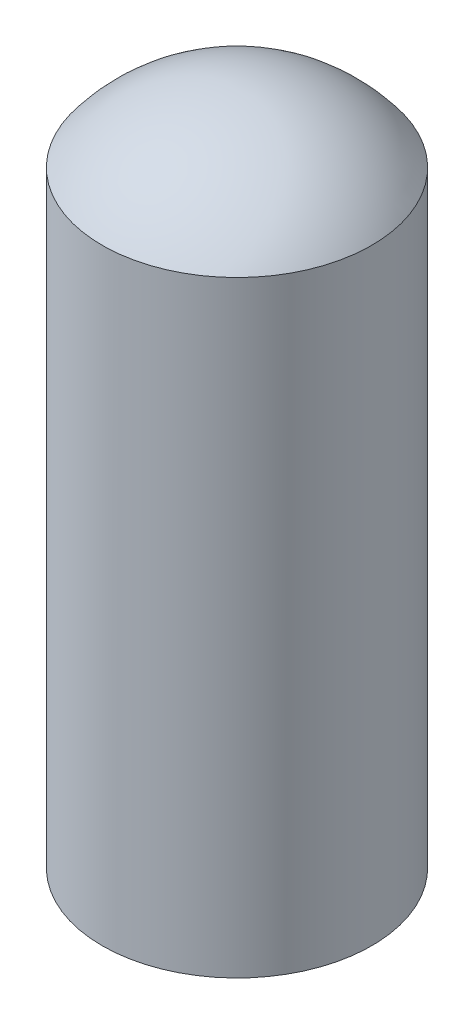
ISO-10303-21;
HEADER;
FILE_DESCRIPTION(('STEP AP214'),'2;1');
FILE_NAME('part.step','',(''),(''),'','','');
FILE_SCHEMA(('AUTOMOTIVE_DESIGN { 1 0 10303 214 1 1 1 1 }'));
ENDSEC;
DATA;
#1=APPLICATION_CONTEXT('core data for automotive mechanical design processes');
#2=APPLICATION_PROTOCOL_DEFINITION('international standard','automotive_design',2000,#1);
#3=PRODUCT_CONTEXT('',#1,'mechanical');
#4=PRODUCT('Part','Part','',(#3));
#5=PRODUCT_RELATED_PRODUCT_CATEGORY('part','',(#4));
#6=PRODUCT_DEFINITION_FORMATION('','',#4);
#7=PRODUCT_DEFINITION_CONTEXT('part definition',#1,'design');
#8=PRODUCT_DEFINITION('design','',#6,#7);
#9=PRODUCT_DEFINITION_SHAPE('','',#8);
#10=(LENGTH_UNIT() NAMED_UNIT(*) SI_UNIT(.MILLI.,.METRE.));
#11=(NAMED_UNIT(*) PLANE_ANGLE_UNIT() SI_UNIT($,.RADIAN.));
#12=(NAMED_UNIT(*) SI_UNIT($,.STERADIAN.) SOLID_ANGLE_UNIT());
#13=UNCERTAINTY_MEASURE_WITH_UNIT(LENGTH_MEASURE(1.E-05),#10,'distance_accuracy_value','');
#14=(GEOMETRIC_REPRESENTATION_CONTEXT(3) GLOBAL_UNCERTAINTY_ASSIGNED_CONTEXT((#13)) GLOBAL_UNIT_ASSIGNED_CONTEXT((#10,
#11,#12)) REPRESENTATION_CONTEXT('',''));
#15=CARTESIAN_POINT('',(0.,0.,0.));
#16=DIRECTION('',(0.,0.,1.));
#17=DIRECTION('',(1.,0.,0.));
#18=AXIS2_PLACEMENT_3D('',#15,#16,#17);
#19=CARTESIAN_POINT('',(0.,0.,0.));
#20=DIRECTION('',(0.,1.,0.));
#21=DIRECTION('',(0.,0.,1.));
#22=AXIS2_PLACEMENT_3D('',#19,#20,#21);
#23=PLANE('',#22);
#24=CARTESIAN_POINT('',(0.,0.,0.));
#25=DIRECTION('',(0.,-1.,0.));
#26=DIRECTION('',(0.,0.,-1.));
#27=AXIS2_PLACEMENT_3D('',#24,#25,#26);
#28=CIRCLE('',#27,4.);
#29=CARTESIAN_POINT('',(0.,0.,-4.));
#30=VERTEX_POINT('',#29);
#31=EDGE_CURVE('E10',#30,#30,#28,.T.);
#32=ORIENTED_EDGE('',*,*,#31,.T.);
#33=EDGE_LOOP('',(#32));
#34=FACE_BOUND('',#33,.T.);
#35=ADVANCED_FACE('F35',(#34),#23,.F.);
#36=CARTESIAN_POINT('',(0.,0.,0.));
#37=DIRECTION('',(0.,-1.,0.));
#38=DIRECTION('',(0.,0.,-1.));
#39=AXIS2_PLACEMENT_3D('',#36,#37,#38);
#40=CYLINDRICAL_SURFACE('',#39,4.);
#41=ORIENTED_EDGE('',*,*,#31,.F.);
#42=EDGE_LOOP('',(#41));
#43=FACE_BOUND('',#42,.T.);
#44=CARTESIAN_POINT('',(0.,18.,0.));
#45=DIRECTION('',(0.,-1.,0.));
#46=DIRECTION('',(0.,0.,-1.));
#47=AXIS2_PLACEMENT_3D('',#44,#45,#46);
#48=CIRCLE('',#47,4.);
#49=CARTESIAN_POINT('',(0.,18.,-4.));
#50=VERTEX_POINT('',#49);
#51=EDGE_CURVE('E41',#50,#50,#48,.T.);
#52=ORIENTED_EDGE('',*,*,#51,.T.);
#53=EDGE_LOOP('',(#52));
#54=FACE_BOUND('',#53,.T.);
#55=ADVANCED_FACE('F47',(#43,#54),#40,.T.);
#56=CARTESIAN_POINT('',(0.,15.,0.));
#57=DIRECTION('',(0.,-1.,0.));
#58=DIRECTION('',(-1.,0.,0.));
#59=AXIS2_PLACEMENT_3D('',#56,#57,#58);
#60=SPHERICAL_SURFACE('',#59,5.);
#61=ORIENTED_EDGE('',*,*,#51,.F.);
#62=EDGE_LOOP('',(#61));
#63=FACE_BOUND('',#62,.T.);
#64=ADVANCED_FACE('F49',(#63),#60,.T.);
#65=CLOSED_SHELL('',(#35,#55,#64));
#66=MANIFOLD_SOLID_BREP('B2',#65);
#67=ADVANCED_BREP_SHAPE_REPRESENTATION('',(#18,#66),#14);
#68=SHAPE_DEFINITION_REPRESENTATION(#9,#67);
ENDSEC;
END-ISO-10303-21;
